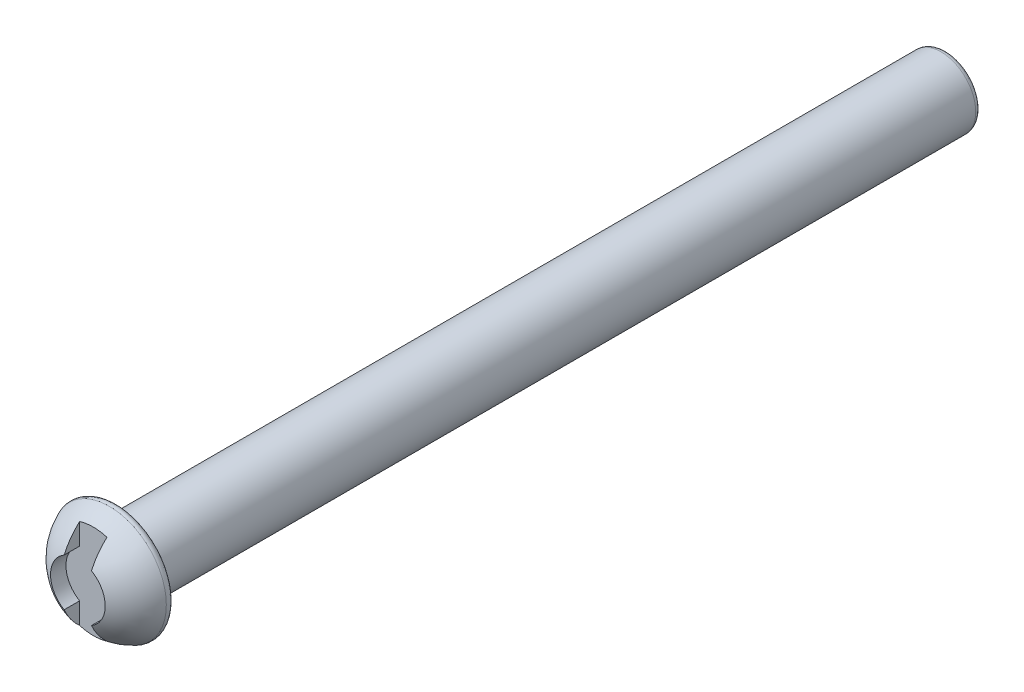
ISO-10303-21;
HEADER;
FILE_DESCRIPTION(('STEP AP214'),'2;1');
FILE_NAME('part.step','',(''),(''),'','','');
FILE_SCHEMA(('AUTOMOTIVE_DESIGN { 1 0 10303 214 1 1 1 1 }'));
ENDSEC;
DATA;
#1=APPLICATION_CONTEXT('core data for automotive mechanical design processes');
#2=APPLICATION_PROTOCOL_DEFINITION('international standard','automotive_design',2000,#1);
#3=PRODUCT_CONTEXT('',#1,'mechanical');
#4=PRODUCT('Part','Part','',(#3));
#5=PRODUCT_RELATED_PRODUCT_CATEGORY('part','',(#4));
#6=PRODUCT_DEFINITION_FORMATION('','',#4);
#7=PRODUCT_DEFINITION_CONTEXT('part definition',#1,'design');
#8=PRODUCT_DEFINITION('design','',#6,#7);
#9=PRODUCT_DEFINITION_SHAPE('','',#8);
#10=(LENGTH_UNIT() NAMED_UNIT(*) SI_UNIT(.MILLI.,.METRE.));
#11=(NAMED_UNIT(*) PLANE_ANGLE_UNIT() SI_UNIT($,.RADIAN.));
#12=(NAMED_UNIT(*) SI_UNIT($,.STERADIAN.) SOLID_ANGLE_UNIT());
#13=UNCERTAINTY_MEASURE_WITH_UNIT(LENGTH_MEASURE(1.E-05),#10,'distance_accuracy_value','');
#14=(GEOMETRIC_REPRESENTATION_CONTEXT(3) GLOBAL_UNCERTAINTY_ASSIGNED_CONTEXT((#13)) GLOBAL_UNIT_ASSIGNED_CONTEXT((#10,
#11,#12)) REPRESENTATION_CONTEXT('',''));
#15=CARTESIAN_POINT('',(0.,0.,0.));
#16=DIRECTION('',(0.,0.,1.));
#17=DIRECTION('',(1.,0.,0.));
#18=AXIS2_PLACEMENT_3D('',#15,#16,#17);
#19=CARTESIAN_POINT('',(0.,0.,-1.68776));
#20=DIRECTION('',(0.,0.,1.));
#21=DIRECTION('',(0.,1.,0.));
#22=AXIS2_PLACEMENT_3D('',#19,#20,#21);
#23=SPHERICAL_SURFACE('',#22,1.68776);
#24=CARTESIAN_POINT('',(0.,0.,-1.04266725626886));
#25=DIRECTION('',(0.,0.,-1.));
#26=DIRECTION('',(-1.,0.,0.));
#27=AXIS2_PLACEMENT_3D('',#24,#25,#26);
#28=CIRCLE('',#27,1.55961186504381);
#29=CARTESIAN_POINT('',(-1.55961186504381,0.,-1.04266725626886));
#30=VERTEX_POINT('',#29);
#31=EDGE_CURVE('E166',#30,#30,#28,.F.);
#32=ORIENTED_EDGE('',*,*,#31,.T.);
#33=EDGE_LOOP('',(#32));
#34=FACE_BOUND('',#33,.T.);
#35=CARTESIAN_POINT('',(-0.375,0.,-1.68776));
#36=DIRECTION('',(-1.,0.,0.));
#37=DIRECTION('',(0.,-1.,0.));
#38=AXIS2_PLACEMENT_3D('',#35,#36,#37);
#39=CIRCLE('',#38,1.64557248931793);
#40=CARTESIAN_POINT('',(-0.375,-1.2347821670238,-0.6));
#41=VERTEX_POINT('',#40);
#42=CARTESIAN_POINT('',(-0.375,-0.649519052838329,-0.175796436417861));
#43=VERTEX_POINT('',#42);
#44=EDGE_CURVE('E156',#41,#43,#39,.T.);
#45=ORIENTED_EDGE('',*,*,#44,.T.);
#46=CARTESIAN_POINT('',(0.,0.,-0.175796436417861));
#47=DIRECTION('',(0.,0.,-1.));
#48=DIRECTION('',(-1.,0.,0.));
#49=AXIS2_PLACEMENT_3D('',#46,#47,#48);
#50=CIRCLE('',#49,0.75);
#51=CARTESIAN_POINT('',(-0.375,0.64951905283833,-0.175796436417862));
#52=VERTEX_POINT('',#51);
#53=EDGE_CURVE('E63',#43,#52,#50,.T.);
#54=ORIENTED_EDGE('',*,*,#53,.T.);
#55=CARTESIAN_POINT('',(-0.375,0.,-1.68776));
#56=DIRECTION('',(-1.,0.,0.));
#57=DIRECTION('',(0.,-1.,0.));
#58=AXIS2_PLACEMENT_3D('',#55,#56,#57);
#59=CIRCLE('',#58,1.64557248931793);
#60=CARTESIAN_POINT('',(-0.375,1.2347821670238,-0.6));
#61=VERTEX_POINT('',#60);
#62=EDGE_CURVE('E160',#52,#61,#59,.T.);
#63=ORIENTED_EDGE('',*,*,#62,.T.);
#64=CARTESIAN_POINT('',(0.,0.,-0.6));
#65=DIRECTION('',(0.,0.,1.));
#66=DIRECTION('',(1.,0.,0.));
#67=AXIS2_PLACEMENT_3D('',#64,#65,#66);
#68=CIRCLE('',#67,1.29046968193755);
#69=CARTESIAN_POINT('',(0.375,1.2347821670238,-0.6));
#70=VERTEX_POINT('',#69);
#71=EDGE_CURVE('E146',#70,#61,#68,.T.);
#72=ORIENTED_EDGE('',*,*,#71,.F.);
#73=CARTESIAN_POINT('',(0.375,0.,-1.68776));
#74=DIRECTION('',(1.,0.,0.));
#75=DIRECTION('',(0.,1.,0.));
#76=AXIS2_PLACEMENT_3D('',#73,#74,#75);
#77=CIRCLE('',#76,1.64557248931793);
#78=CARTESIAN_POINT('',(0.375,0.64951905283833,-0.175796436417861));
#79=VERTEX_POINT('',#78);
#80=EDGE_CURVE('E152',#70,#79,#77,.T.);
#81=ORIENTED_EDGE('',*,*,#80,.T.);
#82=CARTESIAN_POINT('',(0.,0.,-0.175796436417861));
#83=DIRECTION('',(0.,0.,-1.));
#84=DIRECTION('',(-1.,0.,0.));
#85=AXIS2_PLACEMENT_3D('',#82,#83,#84);
#86=CIRCLE('',#85,0.75);
#87=CARTESIAN_POINT('',(0.375,-0.649519052838329,-0.175796436417861));
#88=VERTEX_POINT('',#87);
#89=EDGE_CURVE('E149',#79,#88,#86,.T.);
#90=ORIENTED_EDGE('',*,*,#89,.T.);
#91=CARTESIAN_POINT('',(0.375,0.,-1.68776));
#92=DIRECTION('',(1.,0.,0.));
#93=DIRECTION('',(0.,1.,0.));
#94=AXIS2_PLACEMENT_3D('',#91,#92,#93);
#95=CIRCLE('',#94,1.64557248931793);
#96=CARTESIAN_POINT('',(0.375,-1.2347821670238,-0.6));
#97=VERTEX_POINT('',#96);
#98=EDGE_CURVE('E109',#88,#97,#95,.T.);
#99=ORIENTED_EDGE('',*,*,#98,.T.);
#100=EDGE_CURVE('E101',#41,#97,#68,.T.);
#101=ORIENTED_EDGE('',*,*,#100,.F.);
#102=EDGE_LOOP('',(#45,#54,#63,#72,#81,#90,#99,#101));
#103=FACE_BOUND('',#102,.T.);
#104=ADVANCED_FACE('F39',(#34,#103),#23,.T.);
#105=CARTESIAN_POINT('',(0.,0.,-24.));
#106=DIRECTION('',(0.,0.,1.));
#107=DIRECTION('',(1.,0.,0.));
#108=AXIS2_PLACEMENT_3D('',#105,#106,#107);
#109=PLANE('',#108);
#110=CARTESIAN_POINT('',(0.,0.,-24.));
#111=DIRECTION('',(0.,0.,1.));
#112=DIRECTION('',(1.,0.,0.));
#113=AXIS2_PLACEMENT_3D('',#110,#111,#112);
#114=CIRCLE('',#113,0.799999999999999);
#115=CARTESIAN_POINT('',(0.799999999999999,0.,-24.));
#116=VERTEX_POINT('',#115);
#117=EDGE_CURVE('E11',#116,#116,#114,.F.);
#118=ORIENTED_EDGE('',*,*,#117,.T.);
#119=EDGE_LOOP('',(#118));
#120=FACE_BOUND('',#119,.T.);
#121=ADVANCED_FACE('F189',(#120),#109,.F.);
#122=CARTESIAN_POINT('',(0.,0.,0.));
#123=DIRECTION('',(0.,0.,1.));
#124=DIRECTION('',(1.,0.,0.));
#125=AXIS2_PLACEMENT_3D('',#122,#123,#124);
#126=CYLINDRICAL_SURFACE('',#125,0.949999999999999);
#127=CARTESIAN_POINT('',(0.,0.,-23.85));
#128=DIRECTION('',(0.,0.,1.));
#129=DIRECTION('',(1.,0.,0.));
#130=AXIS2_PLACEMENT_3D('',#127,#128,#129);
#131=CIRCLE('',#130,0.949999999999999);
#132=CARTESIAN_POINT('',(0.949999999999999,0.,-23.85));
#133=VERTEX_POINT('',#132);
#134=EDGE_CURVE('E48',#133,#133,#131,.T.);
#135=ORIENTED_EDGE('',*,*,#134,.T.);
#136=EDGE_LOOP('',(#135));
#137=FACE_BOUND('',#136,.T.);
#138=CARTESIAN_POINT('',(0.,0.,-1.25));
#139=DIRECTION('',(0.,0.,1.));
#140=DIRECTION('',(1.,0.,0.));
#141=AXIS2_PLACEMENT_3D('',#138,#139,#140);
#142=CIRCLE('',#141,0.949999999999999);
#143=CARTESIAN_POINT('',(0.949999999999999,0.,-1.25));
#144=VERTEX_POINT('',#143);
#145=EDGE_CURVE('E135',#144,#144,#142,.T.);
#146=ORIENTED_EDGE('',*,*,#145,.F.);
#147=EDGE_LOOP('',(#146));
#148=FACE_BOUND('',#147,.T.);
#149=ADVANCED_FACE('F177',(#137,#148),#126,.T.);
#150=CARTESIAN_POINT('',(0.,1.63,-1.25));
#151=DIRECTION('',(0.,0.,1.));
#152=DIRECTION('',(1.,0.,0.));
#153=AXIS2_PLACEMENT_3D('',#150,#151,#152);
#154=PLANE('',#153);
#155=CARTESIAN_POINT('',(0.,0.,-1.25));
#156=DIRECTION('',(0.,0.,1.));
#157=DIRECTION('',(1.,0.,0.));
#158=AXIS2_PLACEMENT_3D('',#155,#156,#157);
#159=CIRCLE('',#158,1.42100105559426);
#160=CARTESIAN_POINT('',(1.42100105559426,0.,-1.25));
#161=VERTEX_POINT('',#160);
#162=EDGE_CURVE('E170',#161,#161,#159,.F.);
#163=ORIENTED_EDGE('',*,*,#162,.T.);
#164=EDGE_LOOP('',(#163));
#165=FACE_BOUND('',#164,.T.);
#166=ORIENTED_EDGE('',*,*,#145,.T.);
#167=EDGE_LOOP('',(#166));
#168=FACE_BOUND('',#167,.T.);
#169=ADVANCED_FACE('F201',(#165,#168),#154,.F.);
#170=CARTESIAN_POINT('',(-0.375,-0.649519052838329,-0.6));
#171=DIRECTION('',(-1.,0.,0.));
#172=DIRECTION('',(0.,-1.,0.));
#173=AXIS2_PLACEMENT_3D('',#170,#171,#172);
#174=PLANE('',#173);
#175=DIRECTION('',(0.,-1.,0.));
#176=VECTOR('',#175,1.);
#177=CARTESIAN_POINT('',(-0.375,-0.649519052838329,-0.6));
#178=LINE('',#177,#176);
#179=CARTESIAN_POINT('',(-0.375,-0.649519052838329,-0.6));
#180=VERTEX_POINT('',#179);
#181=EDGE_CURVE('E55',#180,#41,#178,.T.);
#182=ORIENTED_EDGE('',*,*,#181,.F.);
#183=DIRECTION('',(0.,0.,1.));
#184=VECTOR('',#183,1.);
#185=CARTESIAN_POINT('',(-0.375,-0.649519052838329,-0.6));
#186=LINE('',#185,#184);
#187=EDGE_CURVE('E132',#180,#43,#186,.T.);
#188=ORIENTED_EDGE('',*,*,#187,.T.);
#189=ORIENTED_EDGE('',*,*,#44,.F.);
#190=EDGE_LOOP('',(#182,#188,#189));
#191=FACE_BOUND('',#190,.T.);
#192=ADVANCED_FACE('F204',(#191),#174,.F.);
#193=CARTESIAN_POINT('',(0.,0.,-0.6));
#194=DIRECTION('',(0.,0.,1.));
#195=DIRECTION('',(1.,0.,0.));
#196=AXIS2_PLACEMENT_3D('',#193,#194,#195);
#197=CYLINDRICAL_SURFACE('',#196,0.75);
#198=ORIENTED_EDGE('',*,*,#187,.F.);
#199=CARTESIAN_POINT('',(0.,0.,-0.6));
#200=DIRECTION('',(0.,0.,1.));
#201=DIRECTION('',(1.,0.,0.));
#202=AXIS2_PLACEMENT_3D('',#199,#200,#201);
#203=CIRCLE('',#202,0.75);
#204=CARTESIAN_POINT('',(-0.375,0.64951905283833,-0.6));
#205=VERTEX_POINT('',#204);
#206=EDGE_CURVE('E127',#205,#180,#203,.T.);
#207=ORIENTED_EDGE('',*,*,#206,.F.);
#208=DIRECTION('',(0.,0.,1.));
#209=VECTOR('',#208,1.);
#210=CARTESIAN_POINT('',(-0.375,0.64951905283833,-0.6));
#211=LINE('',#210,#209);
#212=EDGE_CURVE('E136',#205,#52,#211,.T.);
#213=ORIENTED_EDGE('',*,*,#212,.T.);
#214=ORIENTED_EDGE('',*,*,#53,.F.);
#215=EDGE_LOOP('',(#198,#207,#213,#214));
#216=FACE_BOUND('',#215,.T.);
#217=ADVANCED_FACE('F217',(#216),#197,.F.);
#218=CARTESIAN_POINT('',(-0.375,1.87097888013581,-0.6));
#219=DIRECTION('',(-1.,0.,0.));
#220=DIRECTION('',(0.,-1.,0.));
#221=AXIS2_PLACEMENT_3D('',#218,#219,#220);
#222=PLANE('',#221);
#223=ORIENTED_EDGE('',*,*,#212,.F.);
#224=DIRECTION('',(0.,-1.,0.));
#225=VECTOR('',#224,1.);
#226=CARTESIAN_POINT('',(-0.375,1.87097888013581,-0.6));
#227=LINE('',#226,#225);
#228=EDGE_CURVE('E122',#61,#205,#227,.T.);
#229=ORIENTED_EDGE('',*,*,#228,.F.);
#230=ORIENTED_EDGE('',*,*,#62,.F.);
#231=EDGE_LOOP('',(#223,#229,#230));
#232=FACE_BOUND('',#231,.T.);
#233=ADVANCED_FACE('F213',(#232),#222,.F.);
#234=CARTESIAN_POINT('',(0.375,1.87097888013581,-0.6));
#235=DIRECTION('',(1.,0.,0.));
#236=DIRECTION('',(0.,1.,0.));
#237=AXIS2_PLACEMENT_3D('',#234,#235,#236);
#238=PLANE('',#237);
#239=DIRECTION('',(0.,1.,0.));
#240=VECTOR('',#239,1.);
#241=CARTESIAN_POINT('',(0.375,1.87097888013581,-0.6));
#242=LINE('',#241,#240);
#243=CARTESIAN_POINT('',(0.375,0.64951905283833,-0.6));
#244=VERTEX_POINT('',#243);
#245=EDGE_CURVE('E119',#244,#70,#242,.T.);
#246=ORIENTED_EDGE('',*,*,#245,.F.);
#247=DIRECTION('',(0.,0.,1.));
#248=VECTOR('',#247,1.);
#249=CARTESIAN_POINT('',(0.375,0.64951905283833,-0.6));
#250=LINE('',#249,#248);
#251=EDGE_CURVE('E113',#244,#79,#250,.T.);
#252=ORIENTED_EDGE('',*,*,#251,.T.);
#253=ORIENTED_EDGE('',*,*,#80,.F.);
#254=EDGE_LOOP('',(#246,#252,#253));
#255=FACE_BOUND('',#254,.T.);
#256=ADVANCED_FACE('F210',(#255),#238,.F.);
#257=CARTESIAN_POINT('',(0.,0.,-0.6));
#258=DIRECTION('',(0.,0.,1.));
#259=DIRECTION('',(1.,0.,0.));
#260=AXIS2_PLACEMENT_3D('',#257,#258,#259);
#261=CYLINDRICAL_SURFACE('',#260,0.75);
#262=ORIENTED_EDGE('',*,*,#251,.F.);
#263=CARTESIAN_POINT('',(0.,0.,-0.6));
#264=DIRECTION('',(0.,0.,1.));
#265=DIRECTION('',(1.,0.,0.));
#266=AXIS2_PLACEMENT_3D('',#263,#264,#265);
#267=CIRCLE('',#266,0.75);
#268=CARTESIAN_POINT('',(0.375,-0.649519052838329,-0.6));
#269=VERTEX_POINT('',#268);
#270=EDGE_CURVE('E99',#269,#244,#267,.T.);
#271=ORIENTED_EDGE('',*,*,#270,.F.);
#272=DIRECTION('',(0.,0.,1.));
#273=VECTOR('',#272,1.);
#274=CARTESIAN_POINT('',(0.375,-0.649519052838329,-0.6));
#275=LINE('',#274,#273);
#276=EDGE_CURVE('E107',#269,#88,#275,.T.);
#277=ORIENTED_EDGE('',*,*,#276,.T.);
#278=ORIENTED_EDGE('',*,*,#89,.F.);
#279=EDGE_LOOP('',(#262,#271,#277,#278));
#280=FACE_BOUND('',#279,.T.);
#281=ADVANCED_FACE('F115',(#280),#261,.F.);
#282=CARTESIAN_POINT('',(0.375,-0.649519052838329,-0.6));
#283=DIRECTION('',(1.,0.,0.));
#284=DIRECTION('',(0.,1.,0.));
#285=AXIS2_PLACEMENT_3D('',#282,#283,#284);
#286=PLANE('',#285);
#287=ORIENTED_EDGE('',*,*,#276,.F.);
#288=DIRECTION('',(0.,1.,0.));
#289=VECTOR('',#288,1.);
#290=CARTESIAN_POINT('',(0.375,-0.649519052838329,-0.6));
#291=LINE('',#290,#289);
#292=EDGE_CURVE('E94',#97,#269,#291,.T.);
#293=ORIENTED_EDGE('',*,*,#292,.F.);
#294=ORIENTED_EDGE('',*,*,#98,.F.);
#295=EDGE_LOOP('',(#287,#293,#294));
#296=FACE_BOUND('',#295,.T.);
#297=ADVANCED_FACE('F108',(#296),#286,.F.);
#298=CARTESIAN_POINT('',(0.,0.,-0.6));
#299=DIRECTION('',(0.,0.,1.));
#300=DIRECTION('',(1.,0.,0.));
#301=AXIS2_PLACEMENT_3D('',#298,#299,#300);
#302=PLANE('',#301);
#303=ORIENTED_EDGE('',*,*,#71,.T.);
#304=ORIENTED_EDGE('',*,*,#228,.T.);
#305=ORIENTED_EDGE('',*,*,#206,.T.);
#306=ORIENTED_EDGE('',*,*,#181,.T.);
#307=ORIENTED_EDGE('',*,*,#100,.T.);
#308=ORIENTED_EDGE('',*,*,#292,.T.);
#309=ORIENTED_EDGE('',*,*,#270,.T.);
#310=ORIENTED_EDGE('',*,*,#245,.T.);
#311=EDGE_LOOP('',(#303,#304,#305,#306,#307,#308,#309,#310));
#312=FACE_BOUND('',#311,.T.);
#313=ADVANCED_FACE('F96',(#312),#302,.T.);
#314=CARTESIAN_POINT('',(0.,0.,-1.1));
#315=DIRECTION('',(0.,0.,1.));
#316=DIRECTION('',(1.,0.,0.));
#317=AXIS2_PLACEMENT_3D('',#314,#315,#316);
#318=TOROIDAL_SURFACE('',#317,1.42100105559426,0.15);
#319=ORIENTED_EDGE('',*,*,#162,.F.);
#320=EDGE_LOOP('',(#319));
#321=FACE_BOUND('',#320,.T.);
#322=ORIENTED_EDGE('',*,*,#31,.F.);
#323=EDGE_LOOP('',(#322));
#324=FACE_BOUND('',#323,.T.);
#325=ADVANCED_FACE('F181',(#321,#324),#318,.T.);
#326=CARTESIAN_POINT('',(0.,0.,-23.85));
#327=DIRECTION('',(0.,0.,1.));
#328=DIRECTION('',(1.,0.,0.));
#329=AXIS2_PLACEMENT_3D('',#326,#327,#328);
#330=TOROIDAL_SURFACE('',#329,0.799999999999999,0.15);
#331=ORIENTED_EDGE('',*,*,#117,.F.);
#332=EDGE_LOOP('',(#331));
#333=FACE_BOUND('',#332,.T.);
#334=ORIENTED_EDGE('',*,*,#134,.F.);
#335=EDGE_LOOP('',(#334));
#336=FACE_BOUND('',#335,.T.);
#337=ADVANCED_FACE('F41',(#333,#336),#330,.T.);
#338=CLOSED_SHELL('',(#104,#121,#149,#169,#192,#217,#233,#256,#281,#297,#313,#325,#337));
#339=MANIFOLD_SOLID_BREP('B2',#338);
#340=ADVANCED_BREP_SHAPE_REPRESENTATION('',(#18,#339),#14);
#341=SHAPE_DEFINITION_REPRESENTATION(#9,#340);
ENDSEC;
END-ISO-10303-21;
